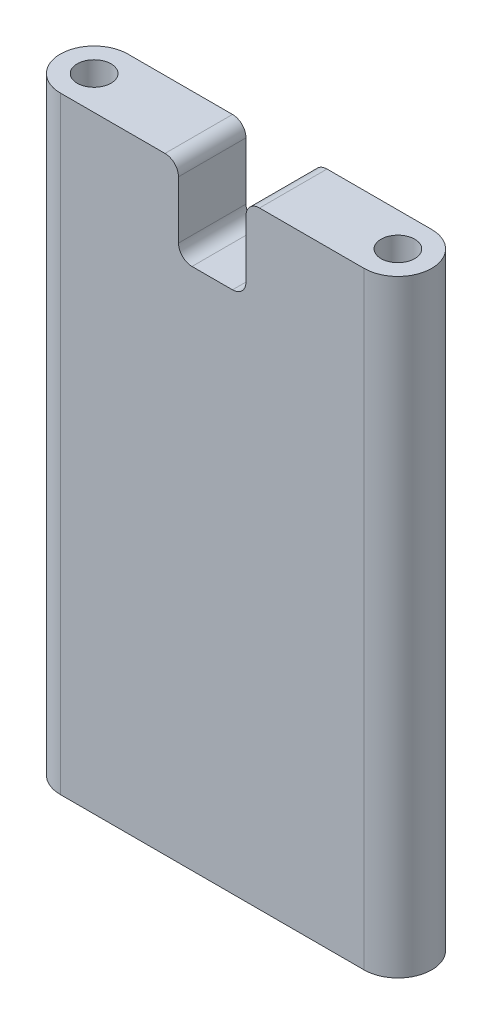
ISO-10303-21;
HEADER;
FILE_DESCRIPTION(('STEP AP214'),'2;1');
FILE_NAME('part.step','',(''),(''),'','','');
FILE_SCHEMA(('AUTOMOTIVE_DESIGN { 1 0 10303 214 1 1 1 1 }'));
ENDSEC;
DATA;
#1=APPLICATION_CONTEXT('core data for automotive mechanical design processes');
#2=APPLICATION_PROTOCOL_DEFINITION('international standard','automotive_design',2000,#1);
#3=PRODUCT_CONTEXT('',#1,'mechanical');
#4=PRODUCT('Part','Part','',(#3));
#5=PRODUCT_RELATED_PRODUCT_CATEGORY('part','',(#4));
#6=PRODUCT_DEFINITION_FORMATION('','',#4);
#7=PRODUCT_DEFINITION_CONTEXT('part definition',#1,'design');
#8=PRODUCT_DEFINITION('design','',#6,#7);
#9=PRODUCT_DEFINITION_SHAPE('','',#8);
#10=(LENGTH_UNIT() NAMED_UNIT(*) SI_UNIT(.MILLI.,.METRE.));
#11=(NAMED_UNIT(*) PLANE_ANGLE_UNIT() SI_UNIT($,.RADIAN.));
#12=(NAMED_UNIT(*) SI_UNIT($,.STERADIAN.) SOLID_ANGLE_UNIT());
#13=UNCERTAINTY_MEASURE_WITH_UNIT(LENGTH_MEASURE(1.E-05),#10,'distance_accuracy_value','');
#14=(GEOMETRIC_REPRESENTATION_CONTEXT(3) GLOBAL_UNCERTAINTY_ASSIGNED_CONTEXT((#13)) GLOBAL_UNIT_ASSIGNED_CONTEXT((#10,
#11,#12)) REPRESENTATION_CONTEXT('',''));
#15=CARTESIAN_POINT('',(0.,0.,0.));
#16=DIRECTION('',(0.,0.,1.));
#17=DIRECTION('',(1.,0.,0.));
#18=AXIS2_PLACEMENT_3D('',#15,#16,#17);
#19=CARTESIAN_POINT('',(-28.575,57.15,0.));
#20=DIRECTION('',(0.,1.,0.));
#21=DIRECTION('',(0.,0.,1.));
#22=AXIS2_PLACEMENT_3D('',#19,#20,#21);
#23=PLANE('',#22);
#24=DIRECTION('',(-1.,0.,0.));
#25=VECTOR('',#24,1.);
#26=CARTESIAN_POINT('',(-28.575,57.15,-6.35));
#27=LINE('',#26,#25);
#28=CARTESIAN_POINT('',(28.575,57.15,-6.35));
#29=VERTEX_POINT('',#28);
#30=CARTESIAN_POINT('',(8.89,57.15,-6.35));
#31=VERTEX_POINT('',#30);
#32=EDGE_CURVE('E232',#29,#31,#27,.T.);
#33=ORIENTED_EDGE('',*,*,#32,.T.);
#34=DIRECTION('',(0.,0.,1.));
#35=VECTOR('',#34,1.);
#36=CARTESIAN_POINT('',(8.89,57.15,6.35));
#37=LINE('',#36,#35);
#38=CARTESIAN_POINT('',(8.89,57.15,6.35));
#39=VERTEX_POINT('',#38);
#40=EDGE_CURVE('E171',#31,#39,#37,.T.);
#41=ORIENTED_EDGE('',*,*,#40,.T.);
#42=DIRECTION('',(1.,0.,0.));
#43=VECTOR('',#42,1.);
#44=CARTESIAN_POINT('',(28.575,57.15,6.35));
#45=LINE('',#44,#43);
#46=CARTESIAN_POINT('',(28.575,57.15,6.35));
#47=VERTEX_POINT('',#46);
#48=EDGE_CURVE('E139',#39,#47,#45,.T.);
#49=ORIENTED_EDGE('',*,*,#48,.T.);
#50=CARTESIAN_POINT('',(28.575,57.15,0.));
#51=DIRECTION('',(0.,1.,0.));
#52=DIRECTION('',(0.,0.,1.));
#53=AXIS2_PLACEMENT_3D('',#50,#51,#52);
#54=CIRCLE('',#53,6.35);
#55=EDGE_CURVE('E138',#47,#29,#54,.T.);
#56=ORIENTED_EDGE('',*,*,#55,.T.);
#57=EDGE_LOOP('',(#33,#41,#49,#56));
#58=FACE_BOUND('',#57,.T.);
#59=CARTESIAN_POINT('',(28.575,57.15,0.));
#60=DIRECTION('',(0.,1.,0.));
#61=DIRECTION('',(0.,0.,1.));
#62=AXIS2_PLACEMENT_3D('',#59,#60,#61);
#63=CIRCLE('',#62,3.175);
#64=CARTESIAN_POINT('',(28.575,57.15,3.175));
#65=VERTEX_POINT('',#64);
#66=EDGE_CURVE('E226',#65,#65,#63,.T.);
#67=ORIENTED_EDGE('',*,*,#66,.F.);
#68=EDGE_LOOP('',(#67));
#69=FACE_BOUND('',#68,.T.);
#70=ADVANCED_FACE('F37',(#58,#69),#23,.T.);
#71=CARTESIAN_POINT('',(-28.575,57.15,6.35));
#72=VERTEX_POINT('',#71);
#73=CARTESIAN_POINT('',(-8.89,57.15,6.35));
#74=VERTEX_POINT('',#73);
#75=EDGE_CURVE('E127',#72,#74,#45,.T.);
#76=ORIENTED_EDGE('',*,*,#75,.T.);
#77=DIRECTION('',(0.,0.,1.));
#78=VECTOR('',#77,1.);
#79=CARTESIAN_POINT('',(-8.89,57.15,-6.35));
#80=LINE('',#79,#78);
#81=CARTESIAN_POINT('',(-8.89,57.15,-6.35));
#82=VERTEX_POINT('',#81);
#83=EDGE_CURVE('E184',#74,#82,#80,.F.);
#84=ORIENTED_EDGE('',*,*,#83,.T.);
#85=CARTESIAN_POINT('',(-28.575,57.15,-6.35));
#86=VERTEX_POINT('',#85);
#87=EDGE_CURVE('E145',#82,#86,#27,.T.);
#88=ORIENTED_EDGE('',*,*,#87,.T.);
#89=CARTESIAN_POINT('',(-28.575,57.15,0.));
#90=DIRECTION('',(0.,1.,0.));
#91=DIRECTION('',(0.,0.,1.));
#92=AXIS2_PLACEMENT_3D('',#89,#90,#91);
#93=CIRCLE('',#92,6.35);
#94=EDGE_CURVE('E142',#86,#72,#93,.T.);
#95=ORIENTED_EDGE('',*,*,#94,.T.);
#96=EDGE_LOOP('',(#76,#84,#88,#95));
#97=FACE_BOUND('',#96,.T.);
#98=CARTESIAN_POINT('',(-28.575,57.15,0.));
#99=DIRECTION('',(0.,1.,0.));
#100=DIRECTION('',(0.,0.,1.));
#101=AXIS2_PLACEMENT_3D('',#98,#99,#100);
#102=CIRCLE('',#101,3.175);
#103=CARTESIAN_POINT('',(-28.575,57.15,3.175));
#104=VERTEX_POINT('',#103);
#105=EDGE_CURVE('E220',#104,#104,#102,.T.);
#106=ORIENTED_EDGE('',*,*,#105,.F.);
#107=EDGE_LOOP('',(#106));
#108=FACE_BOUND('',#107,.T.);
#109=ADVANCED_FACE('F143',(#97,#108),#23,.T.);
#110=CARTESIAN_POINT('',(-28.575,-57.15,0.));
#111=DIRECTION('',(0.,1.,0.));
#112=DIRECTION('',(0.,0.,1.));
#113=AXIS2_PLACEMENT_3D('',#110,#111,#112);
#114=PLANE('',#113);
#115=CARTESIAN_POINT('',(-28.575,-57.15,0.));
#116=DIRECTION('',(0.,1.,0.));
#117=DIRECTION('',(0.,0.,1.));
#118=AXIS2_PLACEMENT_3D('',#115,#116,#117);
#119=CIRCLE('',#118,6.35);
#120=CARTESIAN_POINT('',(-28.575,-57.15,-6.35));
#121=VERTEX_POINT('',#120);
#122=CARTESIAN_POINT('',(-28.575,-57.15,6.35));
#123=VERTEX_POINT('',#122);
#124=EDGE_CURVE('E153',#121,#123,#119,.T.);
#125=ORIENTED_EDGE('',*,*,#124,.F.);
#126=DIRECTION('',(-1.,0.,0.));
#127=VECTOR('',#126,1.);
#128=CARTESIAN_POINT('',(-28.575,-57.15,-6.35));
#129=LINE('',#128,#127);
#130=CARTESIAN_POINT('',(28.575,-57.15,-6.35));
#131=VERTEX_POINT('',#130);
#132=EDGE_CURVE('E149',#131,#121,#129,.T.);
#133=ORIENTED_EDGE('',*,*,#132,.F.);
#134=CARTESIAN_POINT('',(28.575,-57.15,0.));
#135=DIRECTION('',(0.,1.,0.));
#136=DIRECTION('',(0.,0.,1.));
#137=AXIS2_PLACEMENT_3D('',#134,#135,#136);
#138=CIRCLE('',#137,6.35);
#139=CARTESIAN_POINT('',(28.575,-57.15,6.35));
#140=VERTEX_POINT('',#139);
#141=EDGE_CURVE('E239',#140,#131,#138,.T.);
#142=ORIENTED_EDGE('',*,*,#141,.F.);
#143=DIRECTION('',(1.,0.,0.));
#144=VECTOR('',#143,1.);
#145=CARTESIAN_POINT('',(28.575,-57.15,6.35));
#146=LINE('',#145,#144);
#147=EDGE_CURVE('E237',#123,#140,#146,.T.);
#148=ORIENTED_EDGE('',*,*,#147,.F.);
#149=EDGE_LOOP('',(#125,#133,#142,#148));
#150=FACE_BOUND('',#149,.T.);
#151=CARTESIAN_POINT('',(28.575,-57.15,0.));
#152=DIRECTION('',(0.,1.,0.));
#153=DIRECTION('',(0.,0.,1.));
#154=AXIS2_PLACEMENT_3D('',#151,#152,#153);
#155=CIRCLE('',#154,3.175);
#156=CARTESIAN_POINT('',(28.575,-57.15,3.175));
#157=VERTEX_POINT('',#156);
#158=EDGE_CURVE('E223',#157,#157,#155,.T.);
#159=ORIENTED_EDGE('',*,*,#158,.T.);
#160=EDGE_LOOP('',(#159));
#161=FACE_BOUND('',#160,.T.);
#162=CARTESIAN_POINT('',(-28.575,-57.15,0.));
#163=DIRECTION('',(0.,1.,0.));
#164=DIRECTION('',(0.,0.,1.));
#165=AXIS2_PLACEMENT_3D('',#162,#163,#164);
#166=CIRCLE('',#165,3.175);
#167=CARTESIAN_POINT('',(-28.575,-57.15,3.175));
#168=VERTEX_POINT('',#167);
#169=EDGE_CURVE('E212',#168,#168,#166,.T.);
#170=ORIENTED_EDGE('',*,*,#169,.T.);
#171=EDGE_LOOP('',(#170));
#172=FACE_BOUND('',#171,.T.);
#173=ADVANCED_FACE('F250',(#150,#161,#172),#114,.F.);
#174=CARTESIAN_POINT('',(-28.575,57.15,0.));
#175=DIRECTION('',(0.,-1.,0.));
#176=DIRECTION('',(0.,0.,-1.));
#177=AXIS2_PLACEMENT_3D('',#174,#175,#176);
#178=CYLINDRICAL_SURFACE('',#177,6.35);
#179=ORIENTED_EDGE('',*,*,#124,.T.);
#180=DIRECTION('',(0.,-1.,0.));
#181=VECTOR('',#180,1.);
#182=CARTESIAN_POINT('',(-28.575,57.15,6.35));
#183=LINE('',#182,#181);
#184=EDGE_CURVE('E132',#72,#123,#183,.T.);
#185=ORIENTED_EDGE('',*,*,#184,.F.);
#186=ORIENTED_EDGE('',*,*,#94,.F.);
#187=DIRECTION('',(0.,-1.,0.));
#188=VECTOR('',#187,1.);
#189=CARTESIAN_POINT('',(-28.575,57.15,-6.35));
#190=LINE('',#189,#188);
#191=EDGE_CURVE('E235',#86,#121,#190,.T.);
#192=ORIENTED_EDGE('',*,*,#191,.T.);
#193=EDGE_LOOP('',(#179,#185,#186,#192));
#194=FACE_BOUND('',#193,.T.);
#195=ADVANCED_FACE('F151',(#194),#178,.T.);
#196=CARTESIAN_POINT('',(28.575,57.15,6.35));
#197=DIRECTION('',(0.,0.,-1.));
#198=DIRECTION('',(-1.,0.,0.));
#199=AXIS2_PLACEMENT_3D('',#196,#197,#198);
#200=PLANE('',#199);
#201=ORIENTED_EDGE('',*,*,#48,.F.);
#202=CARTESIAN_POINT('',(8.89,54.61,6.35));
#203=DIRECTION('',(0.,0.,-1.));
#204=DIRECTION('',(-1.,0.,0.));
#205=AXIS2_PLACEMENT_3D('',#202,#203,#204);
#206=CIRCLE('',#205,2.54);
#207=CARTESIAN_POINT('',(6.35,54.61,6.35));
#208=VERTEX_POINT('',#207);
#209=EDGE_CURVE('E175',#39,#208,#206,.F.);
#210=ORIENTED_EDGE('',*,*,#209,.T.);
#211=DIRECTION('',(0.,1.,0.));
#212=VECTOR('',#211,1.);
#213=CARTESIAN_POINT('',(6.35,41.275,6.35));
#214=LINE('',#213,#212);
#215=CARTESIAN_POINT('',(6.35,43.815,6.35));
#216=VERTEX_POINT('',#215);
#217=EDGE_CURVE('E214',#216,#208,#214,.T.);
#218=ORIENTED_EDGE('',*,*,#217,.F.);
#219=CARTESIAN_POINT('',(3.81,43.815,6.35));
#220=DIRECTION('',(0.,0.,-1.));
#221=DIRECTION('',(-1.,0.,0.));
#222=AXIS2_PLACEMENT_3D('',#219,#220,#221);
#223=CIRCLE('',#222,2.54);
#224=CARTESIAN_POINT('',(3.81,41.275,6.35));
#225=VERTEX_POINT('',#224);
#226=EDGE_CURVE('E186',#216,#225,#223,.T.);
#227=ORIENTED_EDGE('',*,*,#226,.T.);
#228=DIRECTION('',(1.,0.,0.));
#229=VECTOR('',#228,1.);
#230=CARTESIAN_POINT('',(-6.35,41.275,6.35));
#231=LINE('',#230,#229);
#232=CARTESIAN_POINT('',(-3.81,41.275,6.35));
#233=VERTEX_POINT('',#232);
#234=EDGE_CURVE('E192',#233,#225,#231,.T.);
#235=ORIENTED_EDGE('',*,*,#234,.F.);
#236=CARTESIAN_POINT('',(-3.81,43.815,6.35));
#237=DIRECTION('',(0.,0.,-1.));
#238=DIRECTION('',(-1.,0.,0.));
#239=AXIS2_PLACEMENT_3D('',#236,#237,#238);
#240=CIRCLE('',#239,2.54);
#241=CARTESIAN_POINT('',(-6.35,43.815,6.35));
#242=VERTEX_POINT('',#241);
#243=EDGE_CURVE('E45',#233,#242,#240,.T.);
#244=ORIENTED_EDGE('',*,*,#243,.T.);
#245=DIRECTION('',(0.,-1.,0.));
#246=VECTOR('',#245,1.);
#247=CARTESIAN_POINT('',(-6.35,57.15,6.35));
#248=LINE('',#247,#246);
#249=CARTESIAN_POINT('',(-6.35,54.61,6.35));
#250=VERTEX_POINT('',#249);
#251=EDGE_CURVE('E190',#250,#242,#248,.T.);
#252=ORIENTED_EDGE('',*,*,#251,.F.);
#253=CARTESIAN_POINT('',(-8.89,54.61,6.35));
#254=DIRECTION('',(0.,0.,-1.));
#255=DIRECTION('',(-1.,0.,0.));
#256=AXIS2_PLACEMENT_3D('',#253,#254,#255);
#257=CIRCLE('',#256,2.54);
#258=EDGE_CURVE('E135',#250,#74,#257,.F.);
#259=ORIENTED_EDGE('',*,*,#258,.T.);
#260=ORIENTED_EDGE('',*,*,#75,.F.);
#261=ORIENTED_EDGE('',*,*,#184,.T.);
#262=ORIENTED_EDGE('',*,*,#147,.T.);
#263=DIRECTION('',(0.,-1.,0.));
#264=VECTOR('',#263,1.);
#265=CARTESIAN_POINT('',(28.575,57.15,6.35));
#266=LINE('',#265,#264);
#267=EDGE_CURVE('E155',#47,#140,#266,.T.);
#268=ORIENTED_EDGE('',*,*,#267,.F.);
#269=EDGE_LOOP('',(#201,#210,#218,#227,#235,#244,#252,#259,#260,#261,#262,#268));
#270=FACE_BOUND('',#269,.T.);
#271=ADVANCED_FACE('F130',(#270),#200,.F.);
#272=CARTESIAN_POINT('',(28.575,57.15,0.));
#273=DIRECTION('',(0.,-1.,0.));
#274=DIRECTION('',(0.,0.,-1.));
#275=AXIS2_PLACEMENT_3D('',#272,#273,#274);
#276=CYLINDRICAL_SURFACE('',#275,6.35);
#277=ORIENTED_EDGE('',*,*,#141,.T.);
#278=DIRECTION('',(0.,-1.,0.));
#279=VECTOR('',#278,1.);
#280=CARTESIAN_POINT('',(28.575,57.15,-6.35));
#281=LINE('',#280,#279);
#282=EDGE_CURVE('E160',#29,#131,#281,.T.);
#283=ORIENTED_EDGE('',*,*,#282,.F.);
#284=ORIENTED_EDGE('',*,*,#55,.F.);
#285=ORIENTED_EDGE('',*,*,#267,.T.);
#286=EDGE_LOOP('',(#277,#283,#284,#285));
#287=FACE_BOUND('',#286,.T.);
#288=ADVANCED_FACE('F253',(#287),#276,.T.);
#289=CARTESIAN_POINT('',(-28.575,57.15,-6.35));
#290=DIRECTION('',(0.,0.,1.));
#291=DIRECTION('',(1.,0.,0.));
#292=AXIS2_PLACEMENT_3D('',#289,#290,#291);
#293=PLANE('',#292);
#294=DIRECTION('',(0.,1.,0.));
#295=VECTOR('',#294,1.);
#296=CARTESIAN_POINT('',(6.35,41.275,-6.35));
#297=LINE('',#296,#295);
#298=CARTESIAN_POINT('',(6.35,43.815,-6.35));
#299=VERTEX_POINT('',#298);
#300=CARTESIAN_POINT('',(6.35,54.61,-6.35));
#301=VERTEX_POINT('',#300);
#302=EDGE_CURVE('E210',#299,#301,#297,.T.);
#303=ORIENTED_EDGE('',*,*,#302,.T.);
#304=CARTESIAN_POINT('',(8.89,54.61,-6.35));
#305=DIRECTION('',(0.,0.,1.));
#306=DIRECTION('',(1.,0.,0.));
#307=AXIS2_PLACEMENT_3D('',#304,#305,#306);
#308=CIRCLE('',#307,2.54);
#309=EDGE_CURVE('E178',#301,#31,#308,.F.);
#310=ORIENTED_EDGE('',*,*,#309,.T.);
#311=ORIENTED_EDGE('',*,*,#32,.F.);
#312=ORIENTED_EDGE('',*,*,#282,.T.);
#313=ORIENTED_EDGE('',*,*,#132,.T.);
#314=ORIENTED_EDGE('',*,*,#191,.F.);
#315=ORIENTED_EDGE('',*,*,#87,.F.);
#316=CARTESIAN_POINT('',(-8.89,54.61,-6.35));
#317=DIRECTION('',(0.,0.,1.));
#318=DIRECTION('',(1.,0.,0.));
#319=AXIS2_PLACEMENT_3D('',#316,#317,#318);
#320=CIRCLE('',#319,2.54);
#321=CARTESIAN_POINT('',(-6.35,54.61,-6.35));
#322=VERTEX_POINT('',#321);
#323=EDGE_CURVE('E59',#82,#322,#320,.F.);
#324=ORIENTED_EDGE('',*,*,#323,.T.);
#325=DIRECTION('',(0.,-1.,0.));
#326=VECTOR('',#325,1.);
#327=CARTESIAN_POINT('',(-6.35,57.15,-6.35));
#328=LINE('',#327,#326);
#329=CARTESIAN_POINT('',(-6.35,43.815,-6.35));
#330=VERTEX_POINT('',#329);
#331=EDGE_CURVE('E206',#322,#330,#328,.T.);
#332=ORIENTED_EDGE('',*,*,#331,.T.);
#333=CARTESIAN_POINT('',(-3.81,43.815,-6.35));
#334=DIRECTION('',(0.,0.,1.));
#335=DIRECTION('',(1.,0.,0.));
#336=AXIS2_PLACEMENT_3D('',#333,#334,#335);
#337=CIRCLE('',#336,2.54);
#338=CARTESIAN_POINT('',(-3.81,41.275,-6.35));
#339=VERTEX_POINT('',#338);
#340=EDGE_CURVE('E11',#330,#339,#337,.T.);
#341=ORIENTED_EDGE('',*,*,#340,.T.);
#342=DIRECTION('',(1.,0.,0.));
#343=VECTOR('',#342,1.);
#344=CARTESIAN_POINT('',(-6.35,41.275,-6.35));
#345=LINE('',#344,#343);
#346=CARTESIAN_POINT('',(3.81,41.275,-6.35));
#347=VERTEX_POINT('',#346);
#348=EDGE_CURVE('E204',#339,#347,#345,.T.);
#349=ORIENTED_EDGE('',*,*,#348,.T.);
#350=CARTESIAN_POINT('',(3.81,43.815,-6.35));
#351=DIRECTION('',(0.,0.,1.));
#352=DIRECTION('',(1.,0.,0.));
#353=AXIS2_PLACEMENT_3D('',#350,#351,#352);
#354=CIRCLE('',#353,2.54);
#355=EDGE_CURVE('E188',#347,#299,#354,.T.);
#356=ORIENTED_EDGE('',*,*,#355,.T.);
#357=EDGE_LOOP('',(#303,#310,#311,#312,#313,#314,#315,#324,#332,#341,#349,#356));
#358=FACE_BOUND('',#357,.T.);
#359=ADVANCED_FACE('F203',(#358),#293,.F.);
#360=CARTESIAN_POINT('',(28.575,57.15,0.));
#361=DIRECTION('',(0.,-1.,0.));
#362=DIRECTION('',(0.,0.,-1.));
#363=AXIS2_PLACEMENT_3D('',#360,#361,#362);
#364=CYLINDRICAL_SURFACE('',#363,3.175);
#365=ORIENTED_EDGE('',*,*,#66,.T.);
#366=EDGE_LOOP('',(#365));
#367=FACE_BOUND('',#366,.T.);
#368=ORIENTED_EDGE('',*,*,#158,.F.);
#369=EDGE_LOOP('',(#368));
#370=FACE_BOUND('',#369,.T.);
#371=ADVANCED_FACE('F284',(#367,#370),#364,.F.);
#372=CARTESIAN_POINT('',(-28.575,57.15,0.));
#373=DIRECTION('',(0.,-1.,0.));
#374=DIRECTION('',(0.,0.,-1.));
#375=AXIS2_PLACEMENT_3D('',#372,#373,#374);
#376=CYLINDRICAL_SURFACE('',#375,3.175);
#377=ORIENTED_EDGE('',*,*,#105,.T.);
#378=EDGE_LOOP('',(#377));
#379=FACE_BOUND('',#378,.T.);
#380=ORIENTED_EDGE('',*,*,#169,.F.);
#381=EDGE_LOOP('',(#380));
#382=FACE_BOUND('',#381,.T.);
#383=ADVANCED_FACE('F318',(#379,#382),#376,.F.);
#384=CARTESIAN_POINT('',(6.35,41.275,-6.35));
#385=DIRECTION('',(1.,0.,0.));
#386=DIRECTION('',(0.,1.,0.));
#387=AXIS2_PLACEMENT_3D('',#384,#385,#386);
#388=PLANE('',#387);
#389=ORIENTED_EDGE('',*,*,#302,.F.);
#390=DIRECTION('',(0.,0.,1.));
#391=VECTOR('',#390,1.);
#392=CARTESIAN_POINT('',(6.35,43.815,6.35));
#393=LINE('',#392,#391);
#394=EDGE_CURVE('E157',#299,#216,#393,.T.);
#395=ORIENTED_EDGE('',*,*,#394,.T.);
#396=ORIENTED_EDGE('',*,*,#217,.T.);
#397=DIRECTION('',(0.,0.,1.));
#398=VECTOR('',#397,1.);
#399=CARTESIAN_POINT('',(6.35,54.61,-6.35));
#400=LINE('',#399,#398);
#401=EDGE_CURVE('E154',#208,#301,#400,.F.);
#402=ORIENTED_EDGE('',*,*,#401,.T.);
#403=EDGE_LOOP('',(#389,#395,#396,#402));
#404=FACE_BOUND('',#403,.T.);
#405=ADVANCED_FACE('F262',(#404),#388,.F.);
#406=CARTESIAN_POINT('',(-6.35,41.275,-6.35));
#407=DIRECTION('',(0.,-1.,0.));
#408=DIRECTION('',(0.,0.,-1.));
#409=AXIS2_PLACEMENT_3D('',#406,#407,#408);
#410=PLANE('',#409);
#411=ORIENTED_EDGE('',*,*,#234,.T.);
#412=DIRECTION('',(0.,0.,1.));
#413=VECTOR('',#412,1.);
#414=CARTESIAN_POINT('',(3.81,41.275,-6.35));
#415=LINE('',#414,#413);
#416=EDGE_CURVE('E169',#225,#347,#415,.F.);
#417=ORIENTED_EDGE('',*,*,#416,.T.);
#418=ORIENTED_EDGE('',*,*,#348,.F.);
#419=DIRECTION('',(0.,0.,1.));
#420=VECTOR('',#419,1.);
#421=CARTESIAN_POINT('',(-3.81,41.275,6.35));
#422=LINE('',#421,#420);
#423=EDGE_CURVE('E166',#339,#233,#422,.T.);
#424=ORIENTED_EDGE('',*,*,#423,.T.);
#425=EDGE_LOOP('',(#411,#417,#418,#424));
#426=FACE_BOUND('',#425,.T.);
#427=ADVANCED_FACE('F208',(#426),#410,.F.);
#428=CARTESIAN_POINT('',(-6.35,57.15,-6.35));
#429=DIRECTION('',(-1.,0.,0.));
#430=DIRECTION('',(0.,0.,1.));
#431=AXIS2_PLACEMENT_3D('',#428,#429,#430);
#432=PLANE('',#431);
#433=ORIENTED_EDGE('',*,*,#251,.T.);
#434=DIRECTION('',(0.,0.,1.));
#435=VECTOR('',#434,1.);
#436=CARTESIAN_POINT('',(-6.35,43.815,-6.35));
#437=LINE('',#436,#435);
#438=EDGE_CURVE('E52',#242,#330,#437,.F.);
#439=ORIENTED_EDGE('',*,*,#438,.T.);
#440=ORIENTED_EDGE('',*,*,#331,.F.);
#441=DIRECTION('',(0.,0.,1.));
#442=VECTOR('',#441,1.);
#443=CARTESIAN_POINT('',(-6.35,54.61,6.35));
#444=LINE('',#443,#442);
#445=EDGE_CURVE('E180',#322,#250,#444,.T.);
#446=ORIENTED_EDGE('',*,*,#445,.T.);
#447=EDGE_LOOP('',(#433,#439,#440,#446));
#448=FACE_BOUND('',#447,.T.);
#449=ADVANCED_FACE('F195',(#448),#432,.F.);
#450=CARTESIAN_POINT('',(3.81,43.815,-6.35));
#451=DIRECTION('',(0.,0.,-1.));
#452=DIRECTION('',(-1.,0.,0.));
#453=AXIS2_PLACEMENT_3D('',#450,#451,#452);
#454=CYLINDRICAL_SURFACE('',#453,2.54);
#455=ORIENTED_EDGE('',*,*,#355,.F.);
#456=ORIENTED_EDGE('',*,*,#416,.F.);
#457=ORIENTED_EDGE('',*,*,#226,.F.);
#458=ORIENTED_EDGE('',*,*,#394,.F.);
#459=EDGE_LOOP('',(#455,#456,#457,#458));
#460=FACE_BOUND('',#459,.T.);
#461=ADVANCED_FACE('F267',(#460),#454,.F.);
#462=CARTESIAN_POINT('',(8.89,54.61,0.));
#463=DIRECTION('',(0.,0.,-1.));
#464=DIRECTION('',(-1.,0.,0.));
#465=AXIS2_PLACEMENT_3D('',#462,#463,#464);
#466=CYLINDRICAL_SURFACE('',#465,2.54);
#467=ORIENTED_EDGE('',*,*,#309,.F.);
#468=ORIENTED_EDGE('',*,*,#401,.F.);
#469=ORIENTED_EDGE('',*,*,#209,.F.);
#470=ORIENTED_EDGE('',*,*,#40,.F.);
#471=EDGE_LOOP('',(#467,#468,#469,#470));
#472=FACE_BOUND('',#471,.T.);
#473=ADVANCED_FACE('F265',(#472),#466,.T.);
#474=CARTESIAN_POINT('',(-3.81,43.815,-6.35));
#475=DIRECTION('',(0.,0.,-1.));
#476=DIRECTION('',(-1.,0.,0.));
#477=AXIS2_PLACEMENT_3D('',#474,#475,#476);
#478=CYLINDRICAL_SURFACE('',#477,2.54);
#479=ORIENTED_EDGE('',*,*,#340,.F.);
#480=ORIENTED_EDGE('',*,*,#438,.F.);
#481=ORIENTED_EDGE('',*,*,#243,.F.);
#482=ORIENTED_EDGE('',*,*,#423,.F.);
#483=EDGE_LOOP('',(#479,#480,#481,#482));
#484=FACE_BOUND('',#483,.T.);
#485=ADVANCED_FACE('F199',(#484),#478,.F.);
#486=CARTESIAN_POINT('',(-8.89,54.61,-6.35));
#487=DIRECTION('',(0.,0.,-1.));
#488=DIRECTION('',(-1.,0.,0.));
#489=AXIS2_PLACEMENT_3D('',#486,#487,#488);
#490=CYLINDRICAL_SURFACE('',#489,2.54);
#491=ORIENTED_EDGE('',*,*,#323,.F.);
#492=ORIENTED_EDGE('',*,*,#83,.F.);
#493=ORIENTED_EDGE('',*,*,#258,.F.);
#494=ORIENTED_EDGE('',*,*,#445,.F.);
#495=EDGE_LOOP('',(#491,#492,#493,#494));
#496=FACE_BOUND('',#495,.T.);
#497=ADVANCED_FACE('F39',(#496),#490,.T.);
#498=CLOSED_SHELL('',(#70,#109,#173,#195,#271,#288,#359,#371,#383,#405,#427,#449,#461,#473,#485,#497));
#499=MANIFOLD_SOLID_BREP('B2',#498);
#500=ADVANCED_BREP_SHAPE_REPRESENTATION('',(#18,#499),#14);
#501=SHAPE_DEFINITION_REPRESENTATION(#9,#500);
ENDSEC;
END-ISO-10303-21;
